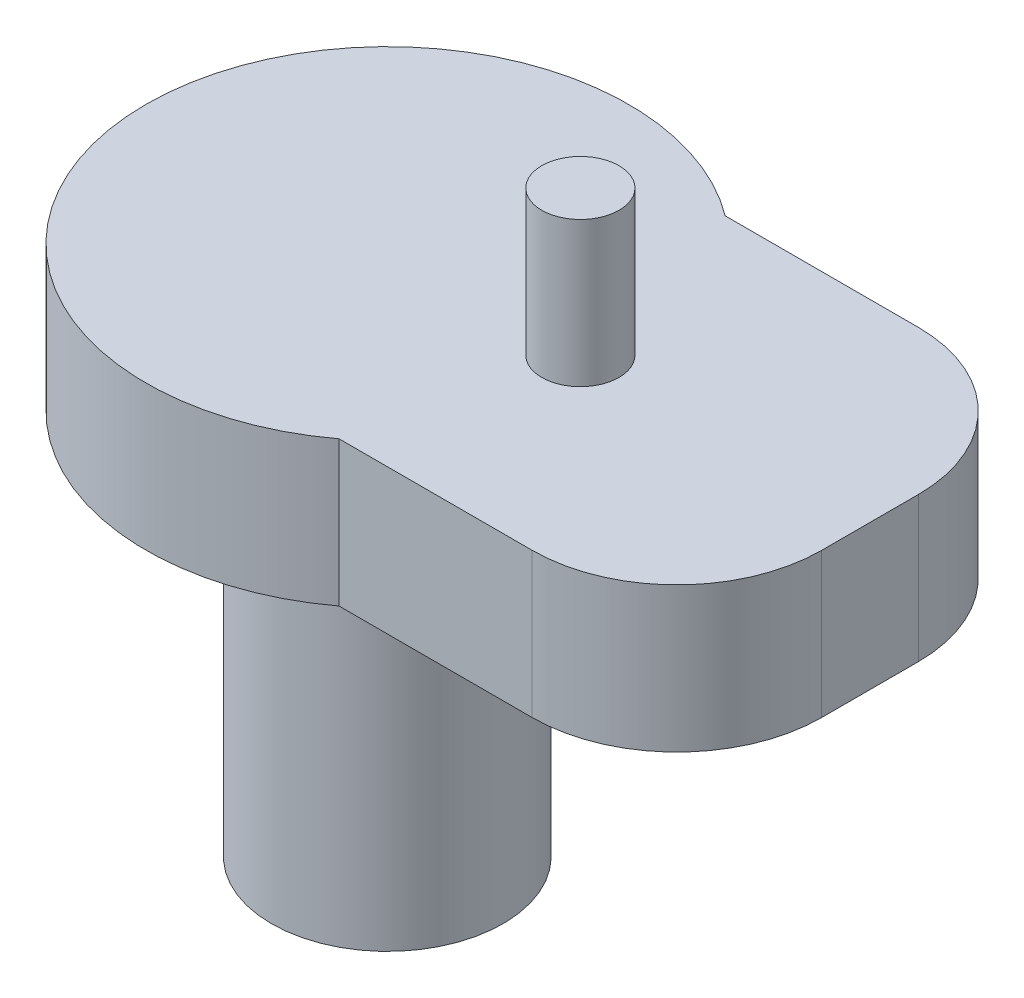
ISO-10303-21;
HEADER;
FILE_DESCRIPTION(('STEP AP214'),'2;1');
FILE_NAME('part.step','',(''),(''),'','','');
FILE_SCHEMA(('AUTOMOTIVE_DESIGN { 1 0 10303 214 1 1 1 1 }'));
ENDSEC;
DATA;
#1=APPLICATION_CONTEXT('core data for automotive mechanical design processes');
#2=APPLICATION_PROTOCOL_DEFINITION('international standard','automotive_design',2000,#1);
#3=PRODUCT_CONTEXT('',#1,'mechanical');
#4=PRODUCT('Part','Part','',(#3));
#5=PRODUCT_RELATED_PRODUCT_CATEGORY('part','',(#4));
#6=PRODUCT_DEFINITION_FORMATION('','',#4);
#7=PRODUCT_DEFINITION_CONTEXT('part definition',#1,'design');
#8=PRODUCT_DEFINITION('design','',#6,#7);
#9=PRODUCT_DEFINITION_SHAPE('','',#8);
#10=(LENGTH_UNIT() NAMED_UNIT(*) SI_UNIT(.MILLI.,.METRE.));
#11=(NAMED_UNIT(*) PLANE_ANGLE_UNIT() SI_UNIT($,.RADIAN.));
#12=(NAMED_UNIT(*) SI_UNIT($,.STERADIAN.) SOLID_ANGLE_UNIT());
#13=UNCERTAINTY_MEASURE_WITH_UNIT(LENGTH_MEASURE(1.E-05),#10,'distance_accuracy_value','');
#14=(GEOMETRIC_REPRESENTATION_CONTEXT(3) GLOBAL_UNCERTAINTY_ASSIGNED_CONTEXT((#13)) GLOBAL_UNIT_ASSIGNED_CONTEXT((#10,
#11,#12)) REPRESENTATION_CONTEXT('',''));
#15=CARTESIAN_POINT('',(0.,0.,0.));
#16=DIRECTION('',(0.,0.,1.));
#17=DIRECTION('',(1.,0.,0.));
#18=AXIS2_PLACEMENT_3D('',#15,#16,#17);
#19=CARTESIAN_POINT('',(0.,15.,0.));
#20=DIRECTION('',(0.,-1.,0.));
#21=DIRECTION('',(0.,0.,-1.));
#22=AXIS2_PLACEMENT_3D('',#19,#20,#21);
#23=CYLINDRICAL_SURFACE('',#22,25.);
#24=CARTESIAN_POINT('',(0.,0.,0.));
#25=DIRECTION('',(0.,1.,0.));
#26=DIRECTION('',(0.,0.,1.));
#27=AXIS2_PLACEMENT_3D('',#24,#25,#26);
#28=CIRCLE('',#27,25.);
#29=CARTESIAN_POINT('',(15.,0.,-20.));
#30=VERTEX_POINT('',#29);
#31=CARTESIAN_POINT('',(15.,0.,20.));
#32=VERTEX_POINT('',#31);
#33=EDGE_CURVE('E89',#30,#32,#28,.T.);
#34=ORIENTED_EDGE('',*,*,#33,.T.);
#35=DIRECTION('',(0.,-1.,0.));
#36=VECTOR('',#35,1.);
#37=CARTESIAN_POINT('',(15.,15.,20.));
#38=LINE('',#37,#36);
#39=CARTESIAN_POINT('',(15.,15.,20.));
#40=VERTEX_POINT('',#39);
#41=EDGE_CURVE('E108',#40,#32,#38,.T.);
#42=ORIENTED_EDGE('',*,*,#41,.F.);
#43=CARTESIAN_POINT('',(0.,15.,0.));
#44=DIRECTION('',(0.,1.,0.));
#45=DIRECTION('',(0.,0.,1.));
#46=AXIS2_PLACEMENT_3D('',#43,#44,#45);
#47=CIRCLE('',#46,25.);
#48=CARTESIAN_POINT('',(15.,15.,-20.));
#49=VERTEX_POINT('',#48);
#50=EDGE_CURVE('E97',#49,#40,#47,.T.);
#51=ORIENTED_EDGE('',*,*,#50,.F.);
#52=DIRECTION('',(0.,-1.,0.));
#53=VECTOR('',#52,1.);
#54=CARTESIAN_POINT('',(15.,15.,-20.));
#55=LINE('',#54,#53);
#56=EDGE_CURVE('E101',#30,#49,#55,.F.);
#57=ORIENTED_EDGE('',*,*,#56,.F.);
#58=EDGE_LOOP('',(#34,#42,#51,#57));
#59=FACE_BOUND('',#58,.T.);
#60=ADVANCED_FACE('F37',(#59),#23,.T.);
#61=CARTESIAN_POINT('',(0.,15.,0.));
#62=DIRECTION('',(0.,1.,0.));
#63=DIRECTION('',(0.,0.,1.));
#64=AXIS2_PLACEMENT_3D('',#61,#62,#63);
#65=PLANE('',#64);
#66=CARTESIAN_POINT('',(20.,15.,0.));
#67=DIRECTION('',(0.,1.,0.));
#68=DIRECTION('',(0.,0.,1.));
#69=AXIS2_PLACEMENT_3D('',#66,#67,#68);
#70=CIRCLE('',#69,4.00000000000001);
#71=CARTESIAN_POINT('',(20.,15.,4.00000000000001));
#72=VERTEX_POINT('',#71);
#73=EDGE_CURVE('E151',#72,#72,#70,.T.);
#74=ORIENTED_EDGE('',*,*,#73,.F.);
#75=EDGE_LOOP('',(#74));
#76=FACE_BOUND('',#75,.T.);
#77=DIRECTION('',(0.,0.,1.));
#78=VECTOR('',#77,1.);
#79=CARTESIAN_POINT('',(50.,15.,-20.));
#80=LINE('',#79,#78);
#81=CARTESIAN_POINT('',(50.,15.,-5.));
#82=VERTEX_POINT('',#81);
#83=CARTESIAN_POINT('',(50.,15.,5.));
#84=VERTEX_POINT('',#83);
#85=EDGE_CURVE('E142',#82,#84,#80,.T.);
#86=ORIENTED_EDGE('',*,*,#85,.F.);
#87=CARTESIAN_POINT('',(35.,15.,-5.));
#88=DIRECTION('',(0.,1.,0.));
#89=DIRECTION('',(0.,0.,1.));
#90=AXIS2_PLACEMENT_3D('',#87,#88,#89);
#91=CIRCLE('',#90,15.);
#92=CARTESIAN_POINT('',(35.,15.,-20.));
#93=VERTEX_POINT('',#92);
#94=EDGE_CURVE('E131',#82,#93,#91,.T.);
#95=ORIENTED_EDGE('',*,*,#94,.T.);
#96=DIRECTION('',(1.,0.,0.));
#97=VECTOR('',#96,1.);
#98=CARTESIAN_POINT('',(-25.001,15.,-20.));
#99=LINE('',#98,#97);
#100=EDGE_CURVE('E104',#49,#93,#99,.T.);
#101=ORIENTED_EDGE('',*,*,#100,.F.);
#102=ORIENTED_EDGE('',*,*,#50,.T.);
#103=DIRECTION('',(1.,0.,0.));
#104=VECTOR('',#103,1.);
#105=CARTESIAN_POINT('',(-25.001,15.,20.));
#106=LINE('',#105,#104);
#107=CARTESIAN_POINT('',(35.,15.,20.));
#108=VERTEX_POINT('',#107);
#109=EDGE_CURVE('E113',#40,#108,#106,.T.);
#110=ORIENTED_EDGE('',*,*,#109,.T.);
#111=CARTESIAN_POINT('',(35.,15.,5.));
#112=DIRECTION('',(0.,1.,0.));
#113=DIRECTION('',(0.,0.,1.));
#114=AXIS2_PLACEMENT_3D('',#111,#112,#113);
#115=CIRCLE('',#114,15.);
#116=EDGE_CURVE('E129',#108,#84,#115,.T.);
#117=ORIENTED_EDGE('',*,*,#116,.T.);
#118=EDGE_LOOP('',(#86,#95,#101,#102,#110,#117));
#119=FACE_BOUND('',#118,.T.);
#120=ADVANCED_FACE('F146',(#76,#119),#65,.T.);
#121=CARTESIAN_POINT('',(0.,0.,0.));
#122=DIRECTION('',(0.,1.,0.));
#123=DIRECTION('',(0.,0.,1.));
#124=AXIS2_PLACEMENT_3D('',#121,#122,#123);
#125=PLANE('',#124);
#126=CARTESIAN_POINT('',(0.,0.,0.));
#127=DIRECTION('',(0.,1.,0.));
#128=DIRECTION('',(0.,0.,1.));
#129=AXIS2_PLACEMENT_3D('',#126,#127,#128);
#130=CIRCLE('',#129,12.);
#131=CARTESIAN_POINT('',(0.,0.,12.));
#132=VERTEX_POINT('',#131);
#133=EDGE_CURVE('E119',#132,#132,#130,.T.);
#134=ORIENTED_EDGE('',*,*,#133,.T.);
#135=EDGE_LOOP('',(#134));
#136=FACE_BOUND('',#135,.T.);
#137=DIRECTION('',(1.,0.,0.));
#138=VECTOR('',#137,1.);
#139=CARTESIAN_POINT('',(-25.001,0.,-20.));
#140=LINE('',#139,#138);
#141=CARTESIAN_POINT('',(35.,0.,-20.));
#142=VERTEX_POINT('',#141);
#143=EDGE_CURVE('E92',#30,#142,#140,.T.);
#144=ORIENTED_EDGE('',*,*,#143,.T.);
#145=CARTESIAN_POINT('',(35.,0.,-5.));
#146=DIRECTION('',(0.,1.,0.));
#147=DIRECTION('',(0.,0.,1.));
#148=AXIS2_PLACEMENT_3D('',#145,#146,#147);
#149=CIRCLE('',#148,15.);
#150=CARTESIAN_POINT('',(50.,0.,-5.));
#151=VERTEX_POINT('',#150);
#152=EDGE_CURVE('E45',#142,#151,#149,.F.);
#153=ORIENTED_EDGE('',*,*,#152,.T.);
#154=DIRECTION('',(0.,0.,-1.));
#155=VECTOR('',#154,1.);
#156=CARTESIAN_POINT('',(50.,0.,20.));
#157=LINE('',#156,#155);
#158=CARTESIAN_POINT('',(50.,0.,5.));
#159=VERTEX_POINT('',#158);
#160=EDGE_CURVE('E116',#159,#151,#157,.T.);
#161=ORIENTED_EDGE('',*,*,#160,.F.);
#162=CARTESIAN_POINT('',(35.,0.,5.));
#163=DIRECTION('',(0.,1.,0.));
#164=DIRECTION('',(0.,0.,1.));
#165=AXIS2_PLACEMENT_3D('',#162,#163,#164);
#166=CIRCLE('',#165,15.);
#167=CARTESIAN_POINT('',(35.,0.,20.));
#168=VERTEX_POINT('',#167);
#169=EDGE_CURVE('E52',#159,#168,#166,.F.);
#170=ORIENTED_EDGE('',*,*,#169,.T.);
#171=DIRECTION('',(1.,0.,0.));
#172=VECTOR('',#171,1.);
#173=CARTESIAN_POINT('',(-25.001,0.,20.));
#174=LINE('',#173,#172);
#175=EDGE_CURVE('E94',#32,#168,#174,.T.);
#176=ORIENTED_EDGE('',*,*,#175,.F.);
#177=ORIENTED_EDGE('',*,*,#33,.F.);
#178=EDGE_LOOP('',(#144,#153,#161,#170,#176,#177));
#179=FACE_BOUND('',#178,.T.);
#180=ADVANCED_FACE('F91',(#136,#179),#125,.F.);
#181=CARTESIAN_POINT('',(0.,-40.,0.));
#182=DIRECTION('',(0.,1.,0.));
#183=DIRECTION('',(0.,0.,1.));
#184=AXIS2_PLACEMENT_3D('',#181,#182,#183);
#185=CYLINDRICAL_SURFACE('',#184,12.);
#186=CARTESIAN_POINT('',(0.,-40.,0.));
#187=DIRECTION('',(0.,1.,0.));
#188=DIRECTION('',(0.,0.,1.));
#189=AXIS2_PLACEMENT_3D('',#186,#187,#188);
#190=CIRCLE('',#189,12.);
#191=CARTESIAN_POINT('',(0.,-40.,12.));
#192=VERTEX_POINT('',#191);
#193=EDGE_CURVE('E98',#192,#192,#190,.T.);
#194=ORIENTED_EDGE('',*,*,#193,.T.);
#195=EDGE_LOOP('',(#194));
#196=FACE_BOUND('',#195,.T.);
#197=ORIENTED_EDGE('',*,*,#133,.F.);
#198=EDGE_LOOP('',(#197));
#199=FACE_BOUND('',#198,.T.);
#200=ADVANCED_FACE('F177',(#196,#199),#185,.T.);
#201=CARTESIAN_POINT('',(0.,-40.,0.));
#202=DIRECTION('',(0.,1.,0.));
#203=DIRECTION('',(0.,0.,1.));
#204=AXIS2_PLACEMENT_3D('',#201,#202,#203);
#205=PLANE('',#204);
#206=ORIENTED_EDGE('',*,*,#193,.F.);
#207=EDGE_LOOP('',(#206));
#208=FACE_BOUND('',#207,.T.);
#209=ADVANCED_FACE('F182',(#208),#205,.F.);
#210=CARTESIAN_POINT('',(50.,0.,0.));
#211=DIRECTION('',(1.,0.,0.));
#212=DIRECTION('',(0.,0.,-1.));
#213=AXIS2_PLACEMENT_3D('',#210,#211,#212);
#214=PLANE('',#213);
#215=ORIENTED_EDGE('',*,*,#160,.T.);
#216=DIRECTION('',(0.,1.,0.));
#217=VECTOR('',#216,1.);
#218=CARTESIAN_POINT('',(50.,0.,-5.));
#219=LINE('',#218,#217);
#220=EDGE_CURVE('E126',#151,#82,#219,.T.);
#221=ORIENTED_EDGE('',*,*,#220,.T.);
#222=ORIENTED_EDGE('',*,*,#85,.T.);
#223=DIRECTION('',(0.,-1.,0.));
#224=VECTOR('',#223,1.);
#225=CARTESIAN_POINT('',(50.,0.,5.));
#226=LINE('',#225,#224);
#227=EDGE_CURVE('E122',#84,#159,#226,.T.);
#228=ORIENTED_EDGE('',*,*,#227,.T.);
#229=EDGE_LOOP('',(#215,#221,#222,#228));
#230=FACE_BOUND('',#229,.T.);
#231=ADVANCED_FACE('F138',(#230),#214,.T.);
#232=CARTESIAN_POINT('',(-25.001,0.,20.));
#233=DIRECTION('',(0.,0.,1.));
#234=DIRECTION('',(1.,0.,0.));
#235=AXIS2_PLACEMENT_3D('',#232,#233,#234);
#236=PLANE('',#235);
#237=ORIENTED_EDGE('',*,*,#175,.T.);
#238=DIRECTION('',(0.,-1.,0.));
#239=VECTOR('',#238,1.);
#240=CARTESIAN_POINT('',(35.,0.,20.));
#241=LINE('',#240,#239);
#242=EDGE_CURVE('E11',#168,#108,#241,.F.);
#243=ORIENTED_EDGE('',*,*,#242,.T.);
#244=ORIENTED_EDGE('',*,*,#109,.F.);
#245=ORIENTED_EDGE('',*,*,#41,.T.);
#246=EDGE_LOOP('',(#237,#243,#244,#245));
#247=FACE_BOUND('',#246,.T.);
#248=ADVANCED_FACE('F156',(#247),#236,.T.);
#249=CARTESIAN_POINT('',(-25.001,0.,-20.));
#250=DIRECTION('',(0.,0.,-1.));
#251=DIRECTION('',(-1.,0.,0.));
#252=AXIS2_PLACEMENT_3D('',#249,#250,#251);
#253=PLANE('',#252);
#254=ORIENTED_EDGE('',*,*,#100,.T.);
#255=DIRECTION('',(0.,1.,0.));
#256=VECTOR('',#255,1.);
#257=CARTESIAN_POINT('',(35.,0.,-20.));
#258=LINE('',#257,#256);
#259=EDGE_CURVE('E60',#93,#142,#258,.F.);
#260=ORIENTED_EDGE('',*,*,#259,.T.);
#261=ORIENTED_EDGE('',*,*,#143,.F.);
#262=ORIENTED_EDGE('',*,*,#56,.T.);
#263=EDGE_LOOP('',(#254,#260,#261,#262));
#264=FACE_BOUND('',#263,.T.);
#265=ADVANCED_FACE('F106',(#264),#253,.T.);
#266=CARTESIAN_POINT('',(35.,0.,-5.));
#267=DIRECTION('',(0.,1.,0.));
#268=DIRECTION('',(0.,0.,1.));
#269=AXIS2_PLACEMENT_3D('',#266,#267,#268);
#270=CYLINDRICAL_SURFACE('',#269,15.);
#271=ORIENTED_EDGE('',*,*,#152,.F.);
#272=ORIENTED_EDGE('',*,*,#259,.F.);
#273=ORIENTED_EDGE('',*,*,#94,.F.);
#274=ORIENTED_EDGE('',*,*,#220,.F.);
#275=EDGE_LOOP('',(#271,#272,#273,#274));
#276=FACE_BOUND('',#275,.T.);
#277=ADVANCED_FACE('F144',(#276),#270,.T.);
#278=CARTESIAN_POINT('',(35.,0.,5.));
#279=DIRECTION('',(0.,-1.,0.));
#280=DIRECTION('',(0.,0.,-1.));
#281=AXIS2_PLACEMENT_3D('',#278,#279,#280);
#282=CYLINDRICAL_SURFACE('',#281,15.);
#283=ORIENTED_EDGE('',*,*,#116,.F.);
#284=ORIENTED_EDGE('',*,*,#242,.F.);
#285=ORIENTED_EDGE('',*,*,#169,.F.);
#286=ORIENTED_EDGE('',*,*,#227,.F.);
#287=EDGE_LOOP('',(#283,#284,#285,#286));
#288=FACE_BOUND('',#287,.T.);
#289=ADVANCED_FACE('F39',(#288),#282,.T.);
#290=CARTESIAN_POINT('',(20.,30.,0.));
#291=DIRECTION('',(0.,-1.,0.));
#292=DIRECTION('',(0.,0.,-1.));
#293=AXIS2_PLACEMENT_3D('',#290,#291,#292);
#294=CYLINDRICAL_SURFACE('',#293,4.00000000000001);
#295=CARTESIAN_POINT('',(20.,30.,0.));
#296=DIRECTION('',(0.,1.,0.));
#297=DIRECTION('',(0.,0.,1.));
#298=AXIS2_PLACEMENT_3D('',#295,#296,#297);
#299=CIRCLE('',#298,4.00000000000001);
#300=CARTESIAN_POINT('',(20.,30.,4.00000000000001));
#301=VERTEX_POINT('',#300);
#302=EDGE_CURVE('E148',#301,#301,#299,.T.);
#303=ORIENTED_EDGE('',*,*,#302,.F.);
#304=EDGE_LOOP('',(#303));
#305=FACE_BOUND('',#304,.T.);
#306=ORIENTED_EDGE('',*,*,#73,.T.);
#307=EDGE_LOOP('',(#306));
#308=FACE_BOUND('',#307,.T.);
#309=ADVANCED_FACE('F160',(#305,#308),#294,.T.);
#310=CARTESIAN_POINT('',(20.,30.,0.));
#311=DIRECTION('',(0.,1.,0.));
#312=DIRECTION('',(0.,0.,1.));
#313=AXIS2_PLACEMENT_3D('',#310,#311,#312);
#314=PLANE('',#313);
#315=ORIENTED_EDGE('',*,*,#302,.T.);
#316=EDGE_LOOP('',(#315));
#317=FACE_BOUND('',#316,.T.);
#318=ADVANCED_FACE('F165',(#317),#314,.T.);
#319=CLOSED_SHELL('',(#60,#120,#180,#200,#209,#231,#248,#265,#277,#289,#309,#318));
#320=MANIFOLD_SOLID_BREP('B2',#319);
#321=ADVANCED_BREP_SHAPE_REPRESENTATION('',(#18,#320),#14);
#322=SHAPE_DEFINITION_REPRESENTATION(#9,#321);
ENDSEC;
END-ISO-10303-21;
